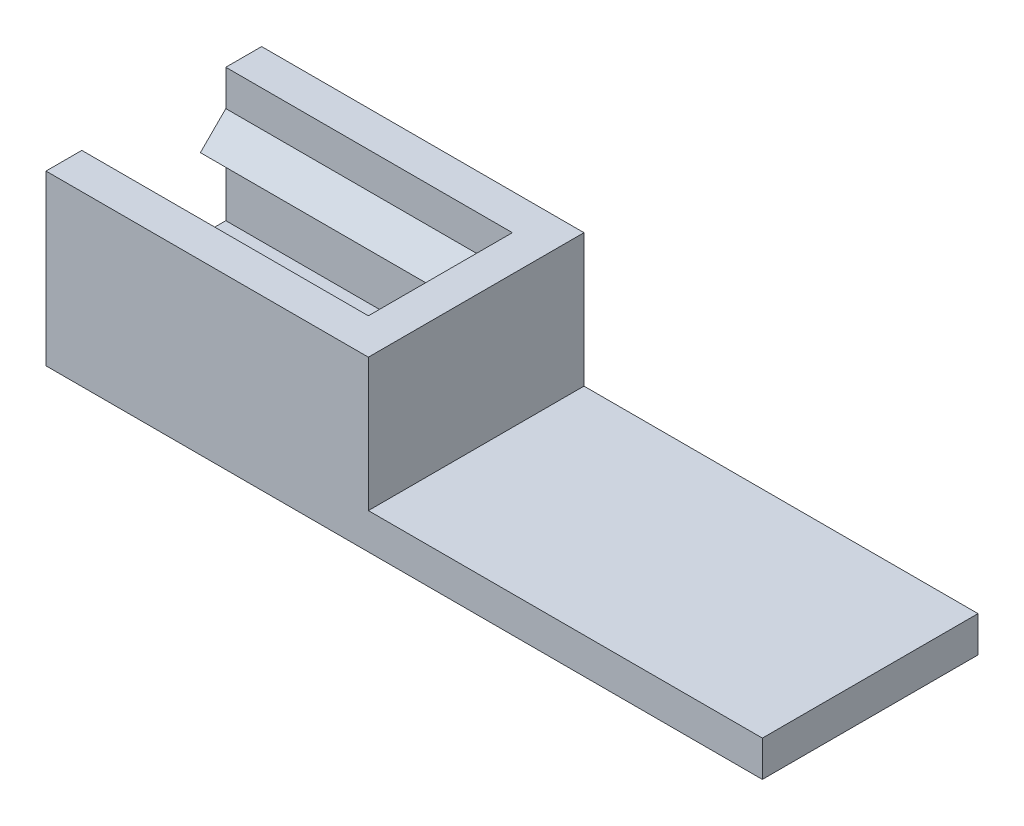
ISO-10303-21;
HEADER;
FILE_DESCRIPTION(('STEP AP214'),'2;1');
FILE_NAME('part.step','',(''),(''),'','','');
FILE_SCHEMA(('AUTOMOTIVE_DESIGN { 1 0 10303 214 1 1 1 1 }'));
ENDSEC;
DATA;
#1=APPLICATION_CONTEXT('core data for automotive mechanical design processes');
#2=APPLICATION_PROTOCOL_DEFINITION('international standard','automotive_design',2000,#1);
#3=PRODUCT_CONTEXT('',#1,'mechanical');
#4=PRODUCT('Part','Part','',(#3));
#5=PRODUCT_RELATED_PRODUCT_CATEGORY('part','',(#4));
#6=PRODUCT_DEFINITION_FORMATION('','',#4);
#7=PRODUCT_DEFINITION_CONTEXT('part definition',#1,'design');
#8=PRODUCT_DEFINITION('design','',#6,#7);
#9=PRODUCT_DEFINITION_SHAPE('','',#8);
#10=(LENGTH_UNIT() NAMED_UNIT(*) SI_UNIT(.MILLI.,.METRE.));
#11=(NAMED_UNIT(*) PLANE_ANGLE_UNIT() SI_UNIT($,.RADIAN.));
#12=(NAMED_UNIT(*) SI_UNIT($,.STERADIAN.) SOLID_ANGLE_UNIT());
#13=UNCERTAINTY_MEASURE_WITH_UNIT(LENGTH_MEASURE(1.E-05),#10,'distance_accuracy_value','');
#14=(GEOMETRIC_REPRESENTATION_CONTEXT(3) GLOBAL_UNCERTAINTY_ASSIGNED_CONTEXT((#13)) GLOBAL_UNIT_ASSIGNED_CONTEXT((#10,
#11,#12)) REPRESENTATION_CONTEXT('',''));
#15=CARTESIAN_POINT('',(0.,0.,0.));
#16=DIRECTION('',(0.,0.,1.));
#17=DIRECTION('',(1.,0.,0.));
#18=AXIS2_PLACEMENT_3D('',#15,#16,#17);
#19=CARTESIAN_POINT('',(20.,5.,10.05));
#20=DIRECTION('',(0.,-1.,0.));
#21=DIRECTION('',(0.,0.,-1.));
#22=AXIS2_PLACEMENT_3D('',#19,#20,#21);
#23=PLANE('',#22);
#24=DIRECTION('',(0.,0.,-1.));
#25=VECTOR('',#24,1.);
#26=CARTESIAN_POINT('',(25.,5.,-15.05));
#27=LINE('',#26,#25);
#28=CARTESIAN_POINT('',(25.,5.,15.05));
#29=VERTEX_POINT('',#28);
#30=CARTESIAN_POINT('',(25.,5.,-15.05));
#31=VERTEX_POINT('',#30);
#32=EDGE_CURVE('E63',#29,#31,#27,.T.);
#33=ORIENTED_EDGE('',*,*,#32,.F.);
#34=DIRECTION('',(-1.,0.,0.));
#35=VECTOR('',#34,1.);
#36=CARTESIAN_POINT('',(80.,5.,15.05));
#37=LINE('',#36,#35);
#38=CARTESIAN_POINT('',(80.,5.,15.05));
#39=VERTEX_POINT('',#38);
#40=EDGE_CURVE('E196',#39,#29,#37,.T.);
#41=ORIENTED_EDGE('',*,*,#40,.F.);
#42=DIRECTION('',(0.,0.,1.));
#43=VECTOR('',#42,1.);
#44=CARTESIAN_POINT('',(80.,5.,15.05));
#45=LINE('',#44,#43);
#46=CARTESIAN_POINT('',(80.,5.,-15.05));
#47=VERTEX_POINT('',#46);
#48=EDGE_CURVE('E194',#47,#39,#45,.T.);
#49=ORIENTED_EDGE('',*,*,#48,.F.);
#50=DIRECTION('',(-1.,0.,0.));
#51=VECTOR('',#50,1.);
#52=CARTESIAN_POINT('',(80.,5.,-15.05));
#53=LINE('',#52,#51);
#54=EDGE_CURVE('E58',#47,#31,#53,.T.);
#55=ORIENTED_EDGE('',*,*,#54,.T.);
#56=EDGE_LOOP('',(#33,#41,#49,#55));
#57=FACE_BOUND('',#56,.T.);
#58=ADVANCED_FACE('F43',(#57),#23,.F.);
#59=DIRECTION('',(0.,0.,1.));
#60=VECTOR('',#59,1.);
#61=CARTESIAN_POINT('',(20.,5.,-15.05));
#62=LINE('',#61,#60);
#63=CARTESIAN_POINT('',(20.,5.,-10.05));
#64=VERTEX_POINT('',#63);
#65=CARTESIAN_POINT('',(20.,5.,10.05));
#66=VERTEX_POINT('',#65);
#67=EDGE_CURVE('E182',#64,#66,#62,.T.);
#68=ORIENTED_EDGE('',*,*,#67,.F.);
#69=DIRECTION('',(-1.,0.,0.));
#70=VECTOR('',#69,1.);
#71=CARTESIAN_POINT('',(20.,5.,-10.05));
#72=LINE('',#71,#70);
#73=CARTESIAN_POINT('',(-20.,5.,-10.05));
#74=VERTEX_POINT('',#73);
#75=EDGE_CURVE('E267',#64,#74,#72,.T.);
#76=ORIENTED_EDGE('',*,*,#75,.T.);
#77=DIRECTION('',(0.,0.,1.));
#78=VECTOR('',#77,1.);
#79=CARTESIAN_POINT('',(-20.,5.,10.05));
#80=LINE('',#79,#78);
#81=CARTESIAN_POINT('',(-20.,5.,10.05));
#82=VERTEX_POINT('',#81);
#83=EDGE_CURVE('E240',#74,#82,#80,.T.);
#84=ORIENTED_EDGE('',*,*,#83,.T.);
#85=DIRECTION('',(-1.,0.,0.));
#86=VECTOR('',#85,1.);
#87=CARTESIAN_POINT('',(20.,5.,10.05));
#88=LINE('',#87,#86);
#89=EDGE_CURVE('E264',#66,#82,#88,.T.);
#90=ORIENTED_EDGE('',*,*,#89,.F.);
#91=EDGE_LOOP('',(#68,#76,#84,#90));
#92=FACE_BOUND('',#91,.T.);
#93=ADVANCED_FACE('F303',(#92),#23,.F.);
#94=CARTESIAN_POINT('',(20.,0.,15.05));
#95=DIRECTION('',(0.,0.,-1.));
#96=DIRECTION('',(-1.,0.,0.));
#97=AXIS2_PLACEMENT_3D('',#94,#95,#96);
#98=PLANE('',#97);
#99=DIRECTION('',(0.,-1.,0.));
#100=VECTOR('',#99,1.);
#101=CARTESIAN_POINT('',(-20.,0.,15.05));
#102=LINE('',#101,#100);
#103=CARTESIAN_POINT('',(-20.,23.55,15.05));
#104=VERTEX_POINT('',#103);
#105=CARTESIAN_POINT('',(-20.,0.,15.05));
#106=VERTEX_POINT('',#105);
#107=EDGE_CURVE('E199',#104,#106,#102,.T.);
#108=ORIENTED_EDGE('',*,*,#107,.T.);
#109=DIRECTION('',(-1.,0.,0.));
#110=VECTOR('',#109,1.);
#111=CARTESIAN_POINT('',(20.,0.,15.05));
#112=LINE('',#111,#110);
#113=CARTESIAN_POINT('',(80.,0.,15.05));
#114=VERTEX_POINT('',#113);
#115=EDGE_CURVE('E11',#114,#106,#112,.T.);
#116=ORIENTED_EDGE('',*,*,#115,.F.);
#117=DIRECTION('',(0.,-1.,0.));
#118=VECTOR('',#117,1.);
#119=CARTESIAN_POINT('',(80.,5.,15.05));
#120=LINE('',#119,#118);
#121=EDGE_CURVE('E186',#39,#114,#120,.T.);
#122=ORIENTED_EDGE('',*,*,#121,.F.);
#123=ORIENTED_EDGE('',*,*,#40,.T.);
#124=DIRECTION('',(0.,-1.,0.));
#125=VECTOR('',#124,1.);
#126=CARTESIAN_POINT('',(25.,54.062456472726,15.05));
#127=LINE('',#126,#125);
#128=CARTESIAN_POINT('',(25.,23.55,15.05));
#129=VERTEX_POINT('',#128);
#130=EDGE_CURVE('E177',#129,#29,#127,.T.);
#131=ORIENTED_EDGE('',*,*,#130,.F.);
#132=DIRECTION('',(-1.,0.,0.));
#133=VECTOR('',#132,1.);
#134=CARTESIAN_POINT('',(20.,23.55,15.05));
#135=LINE('',#134,#133);
#136=EDGE_CURVE('E172',#129,#104,#135,.T.);
#137=ORIENTED_EDGE('',*,*,#136,.T.);
#138=EDGE_LOOP('',(#108,#116,#122,#123,#131,#137));
#139=FACE_BOUND('',#138,.T.);
#140=ADVANCED_FACE('F45',(#139),#98,.F.);
#141=CARTESIAN_POINT('',(20.,0.,-15.05));
#142=DIRECTION('',(0.,1.,0.));
#143=DIRECTION('',(0.,0.,1.));
#144=AXIS2_PLACEMENT_3D('',#141,#142,#143);
#145=PLANE('',#144);
#146=DIRECTION('',(0.,0.,-1.));
#147=VECTOR('',#146,1.);
#148=CARTESIAN_POINT('',(-20.,0.,-15.05));
#149=LINE('',#148,#147);
#150=CARTESIAN_POINT('',(-20.,0.,-15.05));
#151=VERTEX_POINT('',#150);
#152=EDGE_CURVE('E227',#106,#151,#149,.T.);
#153=ORIENTED_EDGE('',*,*,#152,.T.);
#154=DIRECTION('',(-1.,0.,0.));
#155=VECTOR('',#154,1.);
#156=CARTESIAN_POINT('',(20.,0.,-15.05));
#157=LINE('',#156,#155);
#158=CARTESIAN_POINT('',(80.,0.,-15.05));
#159=VERTEX_POINT('',#158);
#160=EDGE_CURVE('E51',#159,#151,#157,.T.);
#161=ORIENTED_EDGE('',*,*,#160,.F.);
#162=DIRECTION('',(0.,0.,-1.));
#163=VECTOR('',#162,1.);
#164=CARTESIAN_POINT('',(80.,0.,15.05));
#165=LINE('',#164,#163);
#166=EDGE_CURVE('E189',#114,#159,#165,.T.);
#167=ORIENTED_EDGE('',*,*,#166,.F.);
#168=ORIENTED_EDGE('',*,*,#115,.T.);
#169=EDGE_LOOP('',(#153,#161,#167,#168));
#170=FACE_BOUND('',#169,.T.);
#171=ADVANCED_FACE('F328',(#170),#145,.F.);
#172=CARTESIAN_POINT('',(20.,0.,-15.05));
#173=DIRECTION('',(0.,0.,1.));
#174=DIRECTION('',(1.,0.,0.));
#175=AXIS2_PLACEMENT_3D('',#172,#173,#174);
#176=PLANE('',#175);
#177=DIRECTION('',(-1.,0.,0.));
#178=VECTOR('',#177,1.);
#179=CARTESIAN_POINT('',(20.,23.55,-15.05));
#180=LINE('',#179,#178);
#181=CARTESIAN_POINT('',(25.,23.55,-15.05));
#182=VERTEX_POINT('',#181);
#183=CARTESIAN_POINT('',(-20.,23.55,-15.05));
#184=VERTEX_POINT('',#183);
#185=EDGE_CURVE('E156',#182,#184,#180,.T.);
#186=ORIENTED_EDGE('',*,*,#185,.F.);
#187=DIRECTION('',(0.,-1.,0.));
#188=VECTOR('',#187,1.);
#189=CARTESIAN_POINT('',(25.,54.062456472726,-15.05));
#190=LINE('',#189,#188);
#191=EDGE_CURVE('E160',#182,#31,#190,.T.);
#192=ORIENTED_EDGE('',*,*,#191,.T.);
#193=ORIENTED_EDGE('',*,*,#54,.F.);
#194=DIRECTION('',(0.,1.,0.));
#195=VECTOR('',#194,1.);
#196=CARTESIAN_POINT('',(80.,5.,-15.05));
#197=LINE('',#196,#195);
#198=EDGE_CURVE('E192',#159,#47,#197,.T.);
#199=ORIENTED_EDGE('',*,*,#198,.F.);
#200=ORIENTED_EDGE('',*,*,#160,.T.);
#201=DIRECTION('',(0.,1.,0.));
#202=VECTOR('',#201,1.);
#203=CARTESIAN_POINT('',(-20.,0.,-15.05));
#204=LINE('',#203,#202);
#205=EDGE_CURVE('E163',#151,#184,#204,.T.);
#206=ORIENTED_EDGE('',*,*,#205,.T.);
#207=EDGE_LOOP('',(#186,#192,#193,#199,#200,#206));
#208=FACE_BOUND('',#207,.T.);
#209=ADVANCED_FACE('F158',(#208),#176,.F.);
#210=CARTESIAN_POINT('',(20.,23.55,-10.05));
#211=DIRECTION('',(0.,0.,-1.));
#212=DIRECTION('',(0.,1.,0.));
#213=AXIS2_PLACEMENT_3D('',#210,#211,#212);
#214=PLANE('',#213);
#215=DIRECTION('',(0.,-1.,0.));
#216=VECTOR('',#215,1.);
#217=CARTESIAN_POINT('',(-20.,23.55,-10.05));
#218=LINE('',#217,#216);
#219=CARTESIAN_POINT('',(-20.,23.55,-10.05));
#220=VERTEX_POINT('',#219);
#221=CARTESIAN_POINT('',(-20.,18.55,-10.05));
#222=VERTEX_POINT('',#221);
#223=EDGE_CURVE('E232',#220,#222,#218,.T.);
#224=ORIENTED_EDGE('',*,*,#223,.T.);
#225=DIRECTION('',(-1.,0.,0.));
#226=VECTOR('',#225,1.);
#227=CARTESIAN_POINT('',(20.,18.55,-10.05));
#228=LINE('',#227,#226);
#229=CARTESIAN_POINT('',(20.,18.55,-10.05));
#230=VERTEX_POINT('',#229);
#231=EDGE_CURVE('E276',#230,#222,#228,.T.);
#232=ORIENTED_EDGE('',*,*,#231,.F.);
#233=DIRECTION('',(0.,-1.,0.));
#234=VECTOR('',#233,1.);
#235=CARTESIAN_POINT('',(20.,23.55,-10.05));
#236=LINE('',#235,#234);
#237=CARTESIAN_POINT('',(20.,23.55,-10.05));
#238=VERTEX_POINT('',#237);
#239=EDGE_CURVE('E200',#238,#230,#236,.T.);
#240=ORIENTED_EDGE('',*,*,#239,.F.);
#241=DIRECTION('',(-1.,0.,0.));
#242=VECTOR('',#241,1.);
#243=CARTESIAN_POINT('',(20.,23.55,-10.05));
#244=LINE('',#243,#242);
#245=EDGE_CURVE('E166',#238,#220,#244,.T.);
#246=ORIENTED_EDGE('',*,*,#245,.T.);
#247=EDGE_LOOP('',(#224,#232,#240,#246));
#248=FACE_BOUND('',#247,.T.);
#249=ADVANCED_FACE('F291',(#248),#214,.F.);
#250=CARTESIAN_POINT('',(20.,18.55,-10.05));
#251=DIRECTION('',(0.,-0.707106781186548,-0.707106781186547));
#252=DIRECTION('',(0.,0.707106781186547,-0.707106781186548));
#253=AXIS2_PLACEMENT_3D('',#250,#251,#252);
#254=PLANE('',#253);
#255=DIRECTION('',(0.,-0.707106781186547,0.707106781186548));
#256=VECTOR('',#255,1.);
#257=CARTESIAN_POINT('',(-20.,18.55,-10.05));
#258=LINE('',#257,#256);
#259=CARTESIAN_POINT('',(-20.,15.,-6.49999999999999));
#260=VERTEX_POINT('',#259);
#261=EDGE_CURVE('E234',#222,#260,#258,.T.);
#262=ORIENTED_EDGE('',*,*,#261,.T.);
#263=DIRECTION('',(-1.,0.,0.));
#264=VECTOR('',#263,1.);
#265=CARTESIAN_POINT('',(20.,15.,-6.49999999999999));
#266=LINE('',#265,#264);
#267=CARTESIAN_POINT('',(20.,15.,-6.49999999999999));
#268=VERTEX_POINT('',#267);
#269=EDGE_CURVE('E273',#268,#260,#266,.T.);
#270=ORIENTED_EDGE('',*,*,#269,.F.);
#271=DIRECTION('',(0.,-0.707106781186547,0.707106781186548));
#272=VECTOR('',#271,1.);
#273=CARTESIAN_POINT('',(20.,18.55,-10.05));
#274=LINE('',#273,#272);
#275=EDGE_CURVE('E203',#230,#268,#274,.T.);
#276=ORIENTED_EDGE('',*,*,#275,.F.);
#277=ORIENTED_EDGE('',*,*,#231,.T.);
#278=EDGE_LOOP('',(#262,#270,#276,#277));
#279=FACE_BOUND('',#278,.T.);
#280=ADVANCED_FACE('F350',(#279),#254,.F.);
#281=CARTESIAN_POINT('',(20.,15.,-6.49999999999999));
#282=DIRECTION('',(0.,0.707106781186548,-0.707106781186548));
#283=DIRECTION('',(0.,0.707106781186548,0.707106781186548));
#284=AXIS2_PLACEMENT_3D('',#281,#282,#283);
#285=PLANE('',#284);
#286=DIRECTION('',(0.,-0.707106781186548,-0.707106781186548));
#287=VECTOR('',#286,1.);
#288=CARTESIAN_POINT('',(-20.,15.,-6.49999999999999));
#289=LINE('',#288,#287);
#290=CARTESIAN_POINT('',(-20.,11.45,-10.05));
#291=VERTEX_POINT('',#290);
#292=EDGE_CURVE('E236',#260,#291,#289,.T.);
#293=ORIENTED_EDGE('',*,*,#292,.T.);
#294=DIRECTION('',(-1.,0.,0.));
#295=VECTOR('',#294,1.);
#296=CARTESIAN_POINT('',(20.,11.45,-10.05));
#297=LINE('',#296,#295);
#298=CARTESIAN_POINT('',(20.,11.45,-10.05));
#299=VERTEX_POINT('',#298);
#300=EDGE_CURVE('E270',#299,#291,#297,.T.);
#301=ORIENTED_EDGE('',*,*,#300,.F.);
#302=DIRECTION('',(0.,-0.707106781186548,-0.707106781186548));
#303=VECTOR('',#302,1.);
#304=CARTESIAN_POINT('',(20.,15.,-6.49999999999999));
#305=LINE('',#304,#303);
#306=EDGE_CURVE('E207',#268,#299,#305,.T.);
#307=ORIENTED_EDGE('',*,*,#306,.F.);
#308=ORIENTED_EDGE('',*,*,#269,.T.);
#309=EDGE_LOOP('',(#293,#301,#307,#308));
#310=FACE_BOUND('',#309,.T.);
#311=ADVANCED_FACE('F347',(#310),#285,.F.);
#312=CARTESIAN_POINT('',(20.,11.45,-10.05));
#313=DIRECTION('',(0.,0.,-1.));
#314=DIRECTION('',(-1.,0.,0.));
#315=AXIS2_PLACEMENT_3D('',#312,#313,#314);
#316=PLANE('',#315);
#317=DIRECTION('',(0.,-1.,0.));
#318=VECTOR('',#317,1.);
#319=CARTESIAN_POINT('',(-20.,11.45,-10.05));
#320=LINE('',#319,#318);
#321=EDGE_CURVE('E238',#291,#74,#320,.T.);
#322=ORIENTED_EDGE('',*,*,#321,.T.);
#323=ORIENTED_EDGE('',*,*,#75,.F.);
#324=DIRECTION('',(0.,-1.,0.));
#325=VECTOR('',#324,1.);
#326=CARTESIAN_POINT('',(20.,11.45,-10.05));
#327=LINE('',#326,#325);
#328=EDGE_CURVE('E210',#299,#64,#327,.T.);
#329=ORIENTED_EDGE('',*,*,#328,.F.);
#330=ORIENTED_EDGE('',*,*,#300,.T.);
#331=EDGE_LOOP('',(#322,#323,#329,#330));
#332=FACE_BOUND('',#331,.T.);
#333=ADVANCED_FACE('F306',(#332),#316,.F.);
#334=CARTESIAN_POINT('',(20.,11.45,10.05));
#335=DIRECTION('',(0.,0.,1.));
#336=DIRECTION('',(1.,0.,0.));
#337=AXIS2_PLACEMENT_3D('',#334,#335,#336);
#338=PLANE('',#337);
#339=DIRECTION('',(0.,1.,0.));
#340=VECTOR('',#339,1.);
#341=CARTESIAN_POINT('',(-20.,11.45,10.05));
#342=LINE('',#341,#340);
#343=CARTESIAN_POINT('',(-20.,11.45,10.05));
#344=VERTEX_POINT('',#343);
#345=EDGE_CURVE('E242',#82,#344,#342,.T.);
#346=ORIENTED_EDGE('',*,*,#345,.T.);
#347=DIRECTION('',(-1.,0.,0.));
#348=VECTOR('',#347,1.);
#349=CARTESIAN_POINT('',(20.,11.45,10.05));
#350=LINE('',#349,#348);
#351=CARTESIAN_POINT('',(20.,11.45,10.05));
#352=VERTEX_POINT('',#351);
#353=EDGE_CURVE('E261',#352,#344,#350,.T.);
#354=ORIENTED_EDGE('',*,*,#353,.F.);
#355=DIRECTION('',(0.,1.,0.));
#356=VECTOR('',#355,1.);
#357=CARTESIAN_POINT('',(20.,11.45,10.05));
#358=LINE('',#357,#356);
#359=EDGE_CURVE('E213',#66,#352,#358,.T.);
#360=ORIENTED_EDGE('',*,*,#359,.F.);
#361=ORIENTED_EDGE('',*,*,#89,.T.);
#362=EDGE_LOOP('',(#346,#354,#360,#361));
#363=FACE_BOUND('',#362,.T.);
#364=ADVANCED_FACE('F312',(#363),#338,.F.);
#365=CARTESIAN_POINT('',(20.,15.,6.49999999999999));
#366=DIRECTION('',(0.,0.707106781186548,0.707106781186548));
#367=DIRECTION('',(0.,-0.707106781186548,0.707106781186548));
#368=AXIS2_PLACEMENT_3D('',#365,#366,#367);
#369=PLANE('',#368);
#370=DIRECTION('',(0.,0.707106781186548,-0.707106781186548));
#371=VECTOR('',#370,1.);
#372=CARTESIAN_POINT('',(-20.,15.,6.49999999999999));
#373=LINE('',#372,#371);
#374=CARTESIAN_POINT('',(-20.,15.,6.49999999999999));
#375=VERTEX_POINT('',#374);
#376=EDGE_CURVE('E244',#344,#375,#373,.T.);
#377=ORIENTED_EDGE('',*,*,#376,.T.);
#378=DIRECTION('',(-1.,0.,0.));
#379=VECTOR('',#378,1.);
#380=CARTESIAN_POINT('',(20.,15.,6.49999999999999));
#381=LINE('',#380,#379);
#382=CARTESIAN_POINT('',(20.,15.,6.49999999999999));
#383=VERTEX_POINT('',#382);
#384=EDGE_CURVE('E258',#383,#375,#381,.T.);
#385=ORIENTED_EDGE('',*,*,#384,.F.);
#386=DIRECTION('',(0.,0.707106781186548,-0.707106781186548));
#387=VECTOR('',#386,1.);
#388=CARTESIAN_POINT('',(20.,15.,6.49999999999999));
#389=LINE('',#388,#387);
#390=EDGE_CURVE('E216',#352,#383,#389,.T.);
#391=ORIENTED_EDGE('',*,*,#390,.F.);
#392=ORIENTED_EDGE('',*,*,#353,.T.);
#393=EDGE_LOOP('',(#377,#385,#391,#392));
#394=FACE_BOUND('',#393,.T.);
#395=ADVANCED_FACE('F315',(#394),#369,.F.);
#396=CARTESIAN_POINT('',(20.,18.55,10.05));
#397=DIRECTION('',(0.,-0.707106781186548,0.707106781186547));
#398=DIRECTION('',(0.,-0.707106781186547,-0.707106781186548));
#399=AXIS2_PLACEMENT_3D('',#396,#397,#398);
#400=PLANE('',#399);
#401=DIRECTION('',(0.,0.707106781186547,0.707106781186548));
#402=VECTOR('',#401,1.);
#403=CARTESIAN_POINT('',(-20.,18.55,10.05));
#404=LINE('',#403,#402);
#405=CARTESIAN_POINT('',(-20.,18.55,10.05));
#406=VERTEX_POINT('',#405);
#407=EDGE_CURVE('E246',#375,#406,#404,.T.);
#408=ORIENTED_EDGE('',*,*,#407,.T.);
#409=DIRECTION('',(-1.,0.,0.));
#410=VECTOR('',#409,1.);
#411=CARTESIAN_POINT('',(20.,18.55,10.05));
#412=LINE('',#411,#410);
#413=CARTESIAN_POINT('',(20.,18.55,10.05));
#414=VERTEX_POINT('',#413);
#415=EDGE_CURVE('E255',#414,#406,#412,.T.);
#416=ORIENTED_EDGE('',*,*,#415,.F.);
#417=DIRECTION('',(0.,0.707106781186547,0.707106781186548));
#418=VECTOR('',#417,1.);
#419=CARTESIAN_POINT('',(20.,18.55,10.05));
#420=LINE('',#419,#418);
#421=EDGE_CURVE('E219',#383,#414,#420,.T.);
#422=ORIENTED_EDGE('',*,*,#421,.F.);
#423=ORIENTED_EDGE('',*,*,#384,.T.);
#424=EDGE_LOOP('',(#408,#416,#422,#423));
#425=FACE_BOUND('',#424,.T.);
#426=ADVANCED_FACE('F318',(#425),#400,.F.);
#427=CARTESIAN_POINT('',(20.,23.55,10.05));
#428=DIRECTION('',(0.,0.,1.));
#429=DIRECTION('',(0.,-1.,0.));
#430=AXIS2_PLACEMENT_3D('',#427,#428,#429);
#431=PLANE('',#430);
#432=DIRECTION('',(0.,1.,0.));
#433=VECTOR('',#432,1.);
#434=CARTESIAN_POINT('',(-20.,23.55,10.05));
#435=LINE('',#434,#433);
#436=CARTESIAN_POINT('',(-20.,23.55,10.05));
#437=VERTEX_POINT('',#436);
#438=EDGE_CURVE('E248',#406,#437,#435,.T.);
#439=ORIENTED_EDGE('',*,*,#438,.T.);
#440=DIRECTION('',(-1.,0.,0.));
#441=VECTOR('',#440,1.);
#442=CARTESIAN_POINT('',(20.,23.55,10.05));
#443=LINE('',#442,#441);
#444=CARTESIAN_POINT('',(20.,23.55,10.05));
#445=VERTEX_POINT('',#444);
#446=EDGE_CURVE('E252',#445,#437,#443,.T.);
#447=ORIENTED_EDGE('',*,*,#446,.F.);
#448=DIRECTION('',(0.,1.,0.));
#449=VECTOR('',#448,1.);
#450=CARTESIAN_POINT('',(20.,23.55,10.05));
#451=LINE('',#450,#449);
#452=EDGE_CURVE('E222',#414,#445,#451,.T.);
#453=ORIENTED_EDGE('',*,*,#452,.F.);
#454=ORIENTED_EDGE('',*,*,#415,.T.);
#455=EDGE_LOOP('',(#439,#447,#453,#454));
#456=FACE_BOUND('',#455,.T.);
#457=ADVANCED_FACE('F322',(#456),#431,.F.);
#458=CARTESIAN_POINT('',(20.,23.55,15.05));
#459=DIRECTION('',(0.,-1.,0.));
#460=DIRECTION('',(0.,0.,-1.));
#461=AXIS2_PLACEMENT_3D('',#458,#459,#460);
#462=PLANE('',#461);
#463=DIRECTION('',(0.,0.,1.));
#464=VECTOR('',#463,1.);
#465=CARTESIAN_POINT('',(-20.,23.55,15.05));
#466=LINE('',#465,#464);
#467=EDGE_CURVE('E204',#437,#104,#466,.T.);
#468=ORIENTED_EDGE('',*,*,#467,.T.);
#469=ORIENTED_EDGE('',*,*,#136,.F.);
#470=DIRECTION('',(0.,0.,1.));
#471=VECTOR('',#470,1.);
#472=CARTESIAN_POINT('',(25.,23.55,-15.05));
#473=LINE('',#472,#471);
#474=EDGE_CURVE('E169',#182,#129,#473,.T.);
#475=ORIENTED_EDGE('',*,*,#474,.F.);
#476=ORIENTED_EDGE('',*,*,#185,.T.);
#477=DIRECTION('',(0.,0.,1.));
#478=VECTOR('',#477,1.);
#479=CARTESIAN_POINT('',(-20.,23.55,-15.05));
#480=LINE('',#479,#478);
#481=EDGE_CURVE('E230',#184,#220,#480,.T.);
#482=ORIENTED_EDGE('',*,*,#481,.T.);
#483=ORIENTED_EDGE('',*,*,#245,.F.);
#484=DIRECTION('',(0.,0.,-1.));
#485=VECTOR('',#484,1.);
#486=CARTESIAN_POINT('',(20.,23.55,-15.05));
#487=LINE('',#486,#485);
#488=EDGE_CURVE('E176',#445,#238,#487,.T.);
#489=ORIENTED_EDGE('',*,*,#488,.F.);
#490=ORIENTED_EDGE('',*,*,#446,.T.);
#491=EDGE_LOOP('',(#468,#469,#475,#476,#482,#483,#489,#490));
#492=FACE_BOUND('',#491,.T.);
#493=ADVANCED_FACE('F170',(#492),#462,.F.);
#494=CARTESIAN_POINT('',(-20.,0.,0.));
#495=DIRECTION('',(-1.,0.,0.));
#496=DIRECTION('',(0.,0.,1.));
#497=AXIS2_PLACEMENT_3D('',#494,#495,#496);
#498=PLANE('',#497);
#499=ORIENTED_EDGE('',*,*,#107,.F.);
#500=ORIENTED_EDGE('',*,*,#467,.F.);
#501=ORIENTED_EDGE('',*,*,#438,.F.);
#502=ORIENTED_EDGE('',*,*,#407,.F.);
#503=ORIENTED_EDGE('',*,*,#376,.F.);
#504=ORIENTED_EDGE('',*,*,#345,.F.);
#505=ORIENTED_EDGE('',*,*,#83,.F.);
#506=ORIENTED_EDGE('',*,*,#321,.F.);
#507=ORIENTED_EDGE('',*,*,#292,.F.);
#508=ORIENTED_EDGE('',*,*,#261,.F.);
#509=ORIENTED_EDGE('',*,*,#223,.F.);
#510=ORIENTED_EDGE('',*,*,#481,.F.);
#511=ORIENTED_EDGE('',*,*,#205,.F.);
#512=ORIENTED_EDGE('',*,*,#152,.F.);
#513=EDGE_LOOP('',(#499,#500,#501,#502,#503,#504,#505,#506,#507,#508,#509,#510,#511,#512));
#514=FACE_BOUND('',#513,.T.);
#515=ADVANCED_FACE('F285',(#514),#498,.T.);
#516=CARTESIAN_POINT('',(80.,0.,0.));
#517=DIRECTION('',(1.,0.,0.));
#518=DIRECTION('',(0.,0.,-1.));
#519=AXIS2_PLACEMENT_3D('',#516,#517,#518);
#520=PLANE('',#519);
#521=ORIENTED_EDGE('',*,*,#121,.T.);
#522=ORIENTED_EDGE('',*,*,#166,.T.);
#523=ORIENTED_EDGE('',*,*,#198,.T.);
#524=ORIENTED_EDGE('',*,*,#48,.T.);
#525=EDGE_LOOP('',(#521,#522,#523,#524));
#526=FACE_BOUND('',#525,.T.);
#527=ADVANCED_FACE('F327',(#526),#520,.T.);
#528=CARTESIAN_POINT('',(20.,54.062456472726,-15.05));
#529=DIRECTION('',(1.,0.,0.));
#530=DIRECTION('',(0.,0.,-1.));
#531=AXIS2_PLACEMENT_3D('',#528,#529,#530);
#532=PLANE('',#531);
#533=ORIENTED_EDGE('',*,*,#488,.T.);
#534=ORIENTED_EDGE('',*,*,#239,.T.);
#535=ORIENTED_EDGE('',*,*,#275,.T.);
#536=ORIENTED_EDGE('',*,*,#306,.T.);
#537=ORIENTED_EDGE('',*,*,#328,.T.);
#538=ORIENTED_EDGE('',*,*,#67,.T.);
#539=ORIENTED_EDGE('',*,*,#359,.T.);
#540=ORIENTED_EDGE('',*,*,#390,.T.);
#541=ORIENTED_EDGE('',*,*,#421,.T.);
#542=ORIENTED_EDGE('',*,*,#452,.T.);
#543=EDGE_LOOP('',(#533,#534,#535,#536,#537,#538,#539,#540,#541,#542));
#544=FACE_BOUND('',#543,.T.);
#545=ADVANCED_FACE('F295',(#544),#532,.F.);
#546=CARTESIAN_POINT('',(25.,54.062456472726,-15.05));
#547=DIRECTION('',(-1.,0.,0.));
#548=DIRECTION('',(0.,0.,1.));
#549=AXIS2_PLACEMENT_3D('',#546,#547,#548);
#550=PLANE('',#549);
#551=ORIENTED_EDGE('',*,*,#191,.F.);
#552=ORIENTED_EDGE('',*,*,#474,.T.);
#553=ORIENTED_EDGE('',*,*,#130,.T.);
#554=ORIENTED_EDGE('',*,*,#32,.T.);
#555=EDGE_LOOP('',(#551,#552,#553,#554));
#556=FACE_BOUND('',#555,.T.);
#557=ADVANCED_FACE('F179',(#556),#550,.F.);
#558=CLOSED_SHELL('',(#58,#93,#140,#171,#209,#249,#280,#311,#333,#364,#395,#426,#457,#493,#515,
#527,#545,#557));
#559=MANIFOLD_SOLID_BREP('B2',#558);
#560=ADVANCED_BREP_SHAPE_REPRESENTATION('',(#18,#559),#14);
#561=SHAPE_DEFINITION_REPRESENTATION(#9,#560);
ENDSEC;
END-ISO-10303-21;
